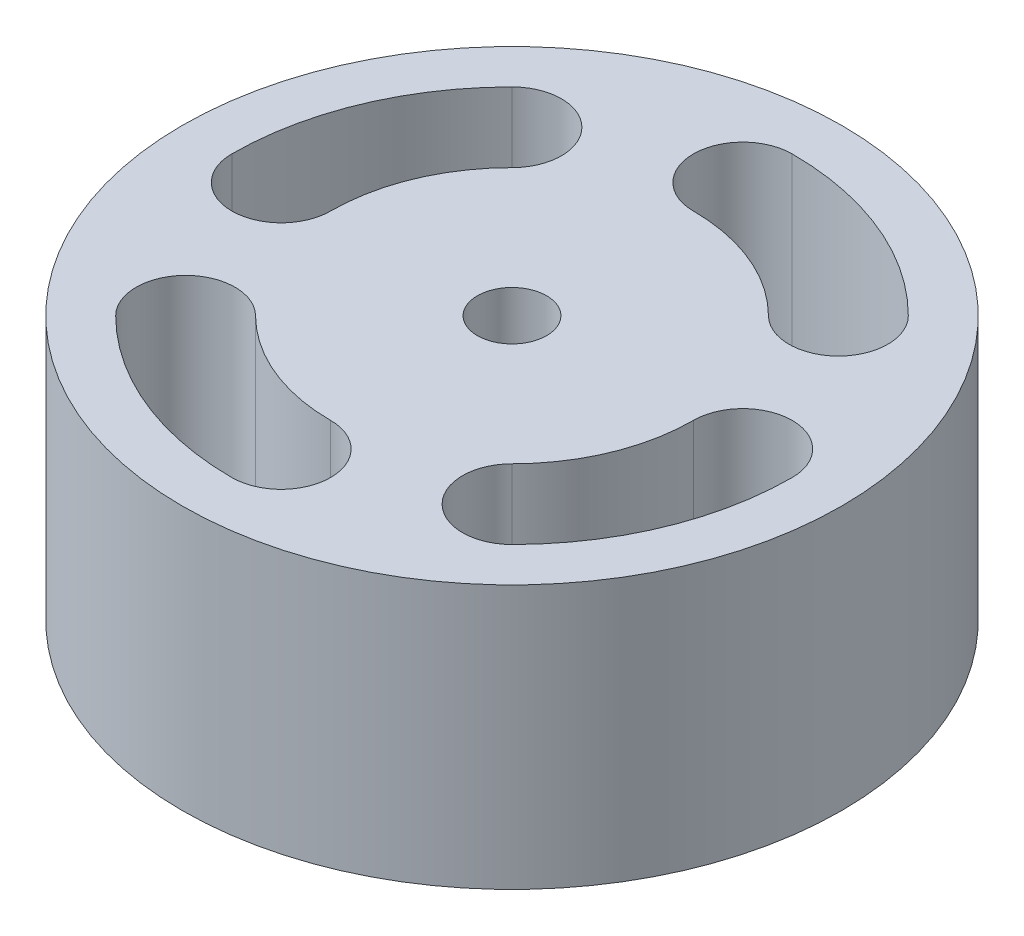
ISO-10303-21;
HEADER;
FILE_DESCRIPTION(('STEP AP214'),'2;1');
FILE_NAME('part.step','',(''),(''),'','','');
FILE_SCHEMA(('AUTOMOTIVE_DESIGN { 1 0 10303 214 1 1 1 1 }'));
ENDSEC;
DATA;
#1=APPLICATION_CONTEXT('core data for automotive mechanical design processes');
#2=APPLICATION_PROTOCOL_DEFINITION('international standard','automotive_design',2000,#1);
#3=PRODUCT_CONTEXT('',#1,'mechanical');
#4=PRODUCT('Part','Part','',(#3));
#5=PRODUCT_RELATED_PRODUCT_CATEGORY('part','',(#4));
#6=PRODUCT_DEFINITION_FORMATION('','',#4);
#7=PRODUCT_DEFINITION_CONTEXT('part definition',#1,'design');
#8=PRODUCT_DEFINITION('design','',#6,#7);
#9=PRODUCT_DEFINITION_SHAPE('','',#8);
#10=(LENGTH_UNIT() NAMED_UNIT(*) SI_UNIT(.MILLI.,.METRE.));
#11=(NAMED_UNIT(*) PLANE_ANGLE_UNIT() SI_UNIT($,.RADIAN.));
#12=(NAMED_UNIT(*) SI_UNIT($,.STERADIAN.) SOLID_ANGLE_UNIT());
#13=UNCERTAINTY_MEASURE_WITH_UNIT(LENGTH_MEASURE(1.E-05),#10,'distance_accuracy_value','');
#14=(GEOMETRIC_REPRESENTATION_CONTEXT(3) GLOBAL_UNCERTAINTY_ASSIGNED_CONTEXT((#13)) GLOBAL_UNIT_ASSIGNED_CONTEXT((#10,
#11,#12)) REPRESENTATION_CONTEXT('',''));
#15=CARTESIAN_POINT('',(0.,0.,0.));
#16=DIRECTION('',(0.,0.,1.));
#17=DIRECTION('',(1.,0.,0.));
#18=AXIS2_PLACEMENT_3D('',#15,#16,#17);
#19=CARTESIAN_POINT('',(0.,20.,0.));
#20=DIRECTION('',(0.,-1.,0.));
#21=DIRECTION('',(0.,0.,-1.));
#22=AXIS2_PLACEMENT_3D('',#19,#20,#21);
#23=CYLINDRICAL_SURFACE('',#22,50.);
#24=CARTESIAN_POINT('',(0.,20.,0.));
#25=DIRECTION('',(0.,1.,0.));
#26=DIRECTION('',(0.,0.,1.));
#27=AXIS2_PLACEMENT_3D('',#24,#25,#26);
#28=CIRCLE('',#27,50.);
#29=CARTESIAN_POINT('',(0.,20.,50.));
#30=VERTEX_POINT('',#29);
#31=EDGE_CURVE('E11',#30,#30,#28,.T.);
#32=ORIENTED_EDGE('',*,*,#31,.F.);
#33=EDGE_LOOP('',(#32));
#34=FACE_BOUND('',#33,.T.);
#35=CARTESIAN_POINT('',(0.,-20.,0.));
#36=DIRECTION('',(0.,-1.,0.));
#37=DIRECTION('',(0.,0.,-1.));
#38=AXIS2_PLACEMENT_3D('',#35,#36,#37);
#39=CIRCLE('',#38,50.);
#40=CARTESIAN_POINT('',(0.,-20.,-50.));
#41=VERTEX_POINT('',#40);
#42=EDGE_CURVE('E225',#41,#41,#39,.T.);
#43=ORIENTED_EDGE('',*,*,#42,.F.);
#44=EDGE_LOOP('',(#43));
#45=FACE_BOUND('',#44,.T.);
#46=ADVANCED_FACE('F47',(#34,#45),#23,.T.);
#47=CARTESIAN_POINT('',(0.,20.,0.));
#48=DIRECTION('',(0.,1.,0.));
#49=DIRECTION('',(0.,0.,1.));
#50=AXIS2_PLACEMENT_3D('',#47,#48,#49);
#51=PLANE('',#50);
#52=CARTESIAN_POINT('',(0.,20.,-35.));
#53=DIRECTION('',(0.,1.,0.));
#54=DIRECTION('',(0.,0.,1.));
#55=AXIS2_PLACEMENT_3D('',#52,#53,#54);
#56=CIRCLE('',#55,7.5);
#57=CARTESIAN_POINT('',(0.,20.,-42.5));
#58=VERTEX_POINT('',#57);
#59=CARTESIAN_POINT('',(0.,20.,-27.5));
#60=VERTEX_POINT('',#59);
#61=EDGE_CURVE('E61',#58,#60,#56,.T.);
#62=ORIENTED_EDGE('',*,*,#61,.F.);
#63=CARTESIAN_POINT('',(0.,20.,0.));
#64=DIRECTION('',(0.,1.,0.));
#65=DIRECTION('',(0.,0.,1.));
#66=AXIS2_PLACEMENT_3D('',#63,#64,#65);
#67=CIRCLE('',#66,42.5);
#68=CARTESIAN_POINT('',(30.0520382004283,20.,-30.0520382004282));
#69=VERTEX_POINT('',#68);
#70=EDGE_CURVE('E268',#69,#58,#67,.T.);
#71=ORIENTED_EDGE('',*,*,#70,.F.);
#72=CARTESIAN_POINT('',(24.7487373415292,20.,-24.7487373415291));
#73=DIRECTION('',(0.,1.,0.));
#74=DIRECTION('',(0.,0.,1.));
#75=AXIS2_PLACEMENT_3D('',#72,#73,#74);
#76=CIRCLE('',#75,7.5);
#77=CARTESIAN_POINT('',(19.4454364826301,20.,-19.44543648263));
#78=VERTEX_POINT('',#77);
#79=EDGE_CURVE('E265',#78,#69,#76,.T.);
#80=ORIENTED_EDGE('',*,*,#79,.F.);
#81=CARTESIAN_POINT('',(0.,20.,0.));
#82=DIRECTION('',(0.,1.,0.));
#83=DIRECTION('',(0.,0.,1.));
#84=AXIS2_PLACEMENT_3D('',#81,#82,#83);
#85=CIRCLE('',#84,27.5);
#86=EDGE_CURVE('E262',#78,#60,#85,.T.);
#87=ORIENTED_EDGE('',*,*,#86,.T.);
#88=EDGE_LOOP('',(#62,#71,#80,#87));
#89=FACE_BOUND('',#88,.T.);
#90=CARTESIAN_POINT('',(35.,20.,1.2220184685951E-13));
#91=DIRECTION('',(0.,1.,0.));
#92=DIRECTION('',(0.,0.,1.));
#93=AXIS2_PLACEMENT_3D('',#90,#91,#92);
#94=CIRCLE('',#93,7.5);
#95=CARTESIAN_POINT('',(42.5,20.,1.48387956900833E-13));
#96=VERTEX_POINT('',#95);
#97=CARTESIAN_POINT('',(27.5,20.,0.));
#98=VERTEX_POINT('',#97);
#99=EDGE_CURVE('E69',#96,#98,#94,.T.);
#100=ORIENTED_EDGE('',*,*,#99,.F.);
#101=CARTESIAN_POINT('',(0.,20.,0.));
#102=DIRECTION('',(0.,1.,0.));
#103=DIRECTION('',(0.,0.,1.));
#104=AXIS2_PLACEMENT_3D('',#101,#102,#103);
#105=CIRCLE('',#104,42.5);
#106=CARTESIAN_POINT('',(30.0520382004281,20.,30.0520382004284));
#107=VERTEX_POINT('',#106);
#108=EDGE_CURVE('E251',#107,#96,#105,.T.);
#109=ORIENTED_EDGE('',*,*,#108,.F.);
#110=CARTESIAN_POINT('',(24.748737341529,20.,24.7487373415293));
#111=DIRECTION('',(0.,1.,0.));
#112=DIRECTION('',(0.,0.,1.));
#113=AXIS2_PLACEMENT_3D('',#110,#111,#112);
#114=CIRCLE('',#113,7.5);
#115=CARTESIAN_POINT('',(19.44543648263,20.,19.4454364826302));
#116=VERTEX_POINT('',#115);
#117=EDGE_CURVE('E248',#116,#107,#114,.T.);
#118=ORIENTED_EDGE('',*,*,#117,.F.);
#119=CARTESIAN_POINT('',(0.,20.,0.));
#120=DIRECTION('',(0.,1.,0.));
#121=DIRECTION('',(0.,0.,1.));
#122=AXIS2_PLACEMENT_3D('',#119,#120,#121);
#123=CIRCLE('',#122,27.5);
#124=EDGE_CURVE('E244',#116,#98,#123,.T.);
#125=ORIENTED_EDGE('',*,*,#124,.T.);
#126=EDGE_LOOP('',(#100,#109,#118,#125));
#127=FACE_BOUND('',#126,.T.);
#128=CARTESIAN_POINT('',(0.,20.,0.));
#129=DIRECTION('',(0.,1.,0.));
#130=DIRECTION('',(0.,0.,1.));
#131=AXIS2_PLACEMENT_3D('',#128,#129,#130);
#132=CIRCLE('',#131,42.5);
#133=CARTESIAN_POINT('',(-30.0520382004285,20.,30.052038200428));
#134=VERTEX_POINT('',#133);
#135=CARTESIAN_POINT('',(-2.44403693719019E-13,20.,42.5));
#136=VERTEX_POINT('',#135);
#137=EDGE_CURVE('E165',#134,#136,#132,.T.);
#138=ORIENTED_EDGE('',*,*,#137,.F.);
#139=CARTESIAN_POINT('',(-24.7487373415294,20.,24.748737341529));
#140=DIRECTION('',(0.,1.,0.));
#141=DIRECTION('',(0.,0.,1.));
#142=AXIS2_PLACEMENT_3D('',#139,#140,#141);
#143=CIRCLE('',#142,7.5);
#144=CARTESIAN_POINT('',(-19.4454364826302,20.,19.4454364826299));
#145=VERTEX_POINT('',#144);
#146=EDGE_CURVE('E170',#145,#134,#143,.T.);
#147=ORIENTED_EDGE('',*,*,#146,.F.);
#148=CARTESIAN_POINT('',(0.,20.,0.));
#149=DIRECTION('',(0.,1.,0.));
#150=DIRECTION('',(0.,0.,1.));
#151=AXIS2_PLACEMENT_3D('',#148,#149,#150);
#152=CIRCLE('',#151,27.5);
#153=CARTESIAN_POINT('',(-1.92031473636372E-13,20.,27.5));
#154=VERTEX_POINT('',#153);
#155=EDGE_CURVE('E232',#145,#154,#152,.T.);
#156=ORIENTED_EDGE('',*,*,#155,.T.);
#157=CARTESIAN_POINT('',(-2.44403693719019E-13,20.,35.));
#158=DIRECTION('',(0.,1.,0.));
#159=DIRECTION('',(0.,0.,1.));
#160=AXIS2_PLACEMENT_3D('',#157,#158,#159);
#161=CIRCLE('',#160,7.5);
#162=EDGE_CURVE('E229',#136,#154,#161,.T.);
#163=ORIENTED_EDGE('',*,*,#162,.F.);
#164=EDGE_LOOP('',(#138,#147,#156,#163));
#165=FACE_BOUND('',#164,.T.);
#166=CARTESIAN_POINT('',(0.,20.,0.));
#167=DIRECTION('',(0.,1.,0.));
#168=DIRECTION('',(0.,0.,1.));
#169=AXIS2_PLACEMENT_3D('',#166,#167,#168);
#170=CIRCLE('',#169,42.5);
#171=CARTESIAN_POINT('',(-30.0520382004279,20.,-30.0520382004286));
#172=VERTEX_POINT('',#171);
#173=CARTESIAN_POINT('',(-42.5,20.,-4.451638707025E-13));
#174=VERTEX_POINT('',#173);
#175=EDGE_CURVE('E239',#172,#174,#170,.T.);
#176=ORIENTED_EDGE('',*,*,#175,.F.);
#177=CARTESIAN_POINT('',(-24.7487373415289,20.,-24.7487373415295));
#178=DIRECTION('',(0.,1.,0.));
#179=DIRECTION('',(0.,0.,1.));
#180=AXIS2_PLACEMENT_3D('',#177,#178,#179);
#181=CIRCLE('',#180,7.5);
#182=CARTESIAN_POINT('',(-19.4454364826298,20.,-19.4454364826303));
#183=VERTEX_POINT('',#182);
#184=EDGE_CURVE('E285',#183,#172,#181,.T.);
#185=ORIENTED_EDGE('',*,*,#184,.F.);
#186=CARTESIAN_POINT('',(0.,20.,0.));
#187=DIRECTION('',(0.,1.,0.));
#188=DIRECTION('',(0.,0.,1.));
#189=AXIS2_PLACEMENT_3D('',#186,#187,#188);
#190=CIRCLE('',#189,27.5);
#191=CARTESIAN_POINT('',(-27.5,20.,-2.88047210454559E-13));
#192=VERTEX_POINT('',#191);
#193=EDGE_CURVE('E282',#183,#192,#190,.T.);
#194=ORIENTED_EDGE('',*,*,#193,.T.);
#195=CARTESIAN_POINT('',(-35.,20.,-3.66605540578529E-13));
#196=DIRECTION('',(0.,1.,0.));
#197=DIRECTION('',(0.,0.,1.));
#198=AXIS2_PLACEMENT_3D('',#195,#196,#197);
#199=CIRCLE('',#198,7.5);
#200=EDGE_CURVE('E279',#174,#192,#199,.T.);
#201=ORIENTED_EDGE('',*,*,#200,.F.);
#202=EDGE_LOOP('',(#176,#185,#194,#201));
#203=FACE_BOUND('',#202,.T.);
#204=CARTESIAN_POINT('',(0.,20.,0.));
#205=DIRECTION('',(0.,1.,0.));
#206=DIRECTION('',(0.,0.,1.));
#207=AXIS2_PLACEMENT_3D('',#204,#205,#206);
#208=CIRCLE('',#207,5.25);
#209=CARTESIAN_POINT('',(0.,20.,5.25));
#210=VERTEX_POINT('',#209);
#211=EDGE_CURVE('E54',#210,#210,#208,.T.);
#212=ORIENTED_EDGE('',*,*,#211,.F.);
#213=EDGE_LOOP('',(#212));
#214=FACE_BOUND('',#213,.T.);
#215=ORIENTED_EDGE('',*,*,#31,.T.);
#216=EDGE_LOOP('',(#215));
#217=FACE_BOUND('',#216,.T.);
#218=ADVANCED_FACE('F302',(#89,#127,#165,#203,#214,#217),#51,.T.);
#219=CARTESIAN_POINT('',(0.,0.,0.));
#220=DIRECTION('',(0.,1.,0.));
#221=DIRECTION('',(0.,0.,1.));
#222=AXIS2_PLACEMENT_3D('',#219,#220,#221);
#223=CYLINDRICAL_SURFACE('',#222,5.25);
#224=ORIENTED_EDGE('',*,*,#211,.T.);
#225=EDGE_LOOP('',(#224));
#226=FACE_BOUND('',#225,.T.);
#227=CARTESIAN_POINT('',(0.,-20.,0.));
#228=DIRECTION('',(0.,-1.,0.));
#229=DIRECTION('',(0.,0.,-1.));
#230=AXIS2_PLACEMENT_3D('',#227,#228,#229);
#231=CIRCLE('',#230,5.25);
#232=CARTESIAN_POINT('',(0.,-20.,-5.25));
#233=VERTEX_POINT('',#232);
#234=EDGE_CURVE('E222',#233,#233,#231,.F.);
#235=ORIENTED_EDGE('',*,*,#234,.F.);
#236=EDGE_LOOP('',(#235));
#237=FACE_BOUND('',#236,.T.);
#238=ADVANCED_FACE('F299',(#226,#237),#223,.F.);
#239=CARTESIAN_POINT('',(0.,0.,0.));
#240=DIRECTION('',(0.,1.,0.));
#241=DIRECTION('',(0.,0.,1.));
#242=AXIS2_PLACEMENT_3D('',#239,#240,#241);
#243=CYLINDRICAL_SURFACE('',#242,42.5);
#244=ORIENTED_EDGE('',*,*,#175,.T.);
#245=DIRECTION('',(0.,1.,0.));
#246=VECTOR('',#245,1.);
#247=CARTESIAN_POINT('',(-42.5,0.,-4.451638707025E-13));
#248=LINE('',#247,#246);
#249=CARTESIAN_POINT('',(-42.5,-20.,-4.47919326000581E-13));
#250=VERTEX_POINT('',#249);
#251=EDGE_CURVE('E288',#250,#174,#248,.T.);
#252=ORIENTED_EDGE('',*,*,#251,.F.);
#253=CARTESIAN_POINT('',(0.,-20.,0.));
#254=DIRECTION('',(0.,-1.,0.));
#255=DIRECTION('',(0.,0.,-1.));
#256=AXIS2_PLACEMENT_3D('',#253,#254,#255);
#257=CIRCLE('',#256,42.5);
#258=CARTESIAN_POINT('',(-30.0520382004279,-20.,-30.0520382004287));
#259=VERTEX_POINT('',#258);
#260=EDGE_CURVE('E187',#250,#259,#257,.T.);
#261=ORIENTED_EDGE('',*,*,#260,.T.);
#262=DIRECTION('',(0.,1.,0.));
#263=VECTOR('',#262,1.);
#264=CARTESIAN_POINT('',(-30.0520382004279,0.,-30.0520382004286));
#265=LINE('',#264,#263);
#266=EDGE_CURVE('E289',#259,#172,#265,.T.);
#267=ORIENTED_EDGE('',*,*,#266,.T.);
#268=EDGE_LOOP('',(#244,#252,#261,#267));
#269=FACE_BOUND('',#268,.T.);
#270=ADVANCED_FACE('F363',(#269),#243,.F.);
#271=CARTESIAN_POINT('',(-24.7487373415289,0.,-24.7487373415295));
#272=DIRECTION('',(0.,1.,0.));
#273=DIRECTION('',(0.,0.,1.));
#274=AXIS2_PLACEMENT_3D('',#271,#272,#273);
#275=CYLINDRICAL_SURFACE('',#274,7.5);
#276=ORIENTED_EDGE('',*,*,#184,.T.);
#277=ORIENTED_EDGE('',*,*,#266,.F.);
#278=CARTESIAN_POINT('',(-24.7487373415289,-20.,-24.7487373415295));
#279=DIRECTION('',(0.,-1.,0.));
#280=DIRECTION('',(0.,0.,-1.));
#281=AXIS2_PLACEMENT_3D('',#278,#279,#280);
#282=CIRCLE('',#281,7.5);
#283=CARTESIAN_POINT('',(-19.4454364826298,-20.,-19.4454364826303));
#284=VERTEX_POINT('',#283);
#285=EDGE_CURVE('E202',#284,#259,#282,.F.);
#286=ORIENTED_EDGE('',*,*,#285,.F.);
#287=DIRECTION('',(0.,1.,0.));
#288=VECTOR('',#287,1.);
#289=CARTESIAN_POINT('',(-19.4454364826298,0.,-19.4454364826303));
#290=LINE('',#289,#288);
#291=EDGE_CURVE('E291',#284,#183,#290,.T.);
#292=ORIENTED_EDGE('',*,*,#291,.T.);
#293=EDGE_LOOP('',(#276,#277,#286,#292));
#294=FACE_BOUND('',#293,.T.);
#295=ADVANCED_FACE('F359',(#294),#275,.F.);
#296=CARTESIAN_POINT('',(0.,0.,0.));
#297=DIRECTION('',(0.,1.,0.));
#298=DIRECTION('',(0.,0.,1.));
#299=AXIS2_PLACEMENT_3D('',#296,#297,#298);
#300=CYLINDRICAL_SURFACE('',#299,27.5);
#301=ORIENTED_EDGE('',*,*,#193,.F.);
#302=ORIENTED_EDGE('',*,*,#291,.F.);
#303=CARTESIAN_POINT('',(0.,-20.,0.));
#304=DIRECTION('',(0.,-1.,0.));
#305=DIRECTION('',(0.,0.,-1.));
#306=AXIS2_PLACEMENT_3D('',#303,#304,#305);
#307=CIRCLE('',#306,27.5);
#308=CARTESIAN_POINT('',(-27.5,-20.,-2.85308762516775E-13));
#309=VERTEX_POINT('',#308);
#310=EDGE_CURVE('E197',#309,#284,#307,.T.);
#311=ORIENTED_EDGE('',*,*,#310,.F.);
#312=DIRECTION('',(0.,1.,0.));
#313=VECTOR('',#312,1.);
#314=CARTESIAN_POINT('',(-27.5,0.,-2.88047210454559E-13));
#315=LINE('',#314,#313);
#316=EDGE_CURVE('E293',#309,#192,#315,.T.);
#317=ORIENTED_EDGE('',*,*,#316,.T.);
#318=EDGE_LOOP('',(#301,#302,#311,#317));
#319=FACE_BOUND('',#318,.T.);
#320=ADVANCED_FACE('F362',(#319),#300,.T.);
#321=CARTESIAN_POINT('',(-35.,0.,-3.66605540578529E-13));
#322=DIRECTION('',(0.,1.,0.));
#323=DIRECTION('',(0.,0.,1.));
#324=AXIS2_PLACEMENT_3D('',#321,#322,#323);
#325=CYLINDRICAL_SURFACE('',#324,7.5);
#326=ORIENTED_EDGE('',*,*,#200,.T.);
#327=ORIENTED_EDGE('',*,*,#316,.F.);
#328=CARTESIAN_POINT('',(-35.,-20.,-3.66605540578529E-13));
#329=DIRECTION('',(0.,-1.,0.));
#330=DIRECTION('',(0.,0.,-1.));
#331=AXIS2_PLACEMENT_3D('',#328,#329,#330);
#332=CIRCLE('',#331,7.5);
#333=EDGE_CURVE('E193',#250,#309,#332,.F.);
#334=ORIENTED_EDGE('',*,*,#333,.F.);
#335=ORIENTED_EDGE('',*,*,#251,.T.);
#336=EDGE_LOOP('',(#326,#327,#334,#335));
#337=FACE_BOUND('',#336,.T.);
#338=ADVANCED_FACE('F335',(#337),#325,.F.);
#339=CARTESIAN_POINT('',(0.,0.,0.));
#340=DIRECTION('',(0.,1.,0.));
#341=DIRECTION('',(0.,0.,1.));
#342=AXIS2_PLACEMENT_3D('',#339,#340,#341);
#343=CYLINDRICAL_SURFACE('',#342,42.5);
#344=ORIENTED_EDGE('',*,*,#137,.T.);
#345=DIRECTION('',(0.,1.,0.));
#346=VECTOR('',#345,1.);
#347=CARTESIAN_POINT('',(-2.96775913801666E-13,0.,42.5));
#348=LINE('',#347,#346);
#349=CARTESIAN_POINT('',(-2.97694398901027E-13,-20.,42.5));
#350=VERTEX_POINT('',#349);
#351=EDGE_CURVE('E159',#350,#136,#348,.T.);
#352=ORIENTED_EDGE('',*,*,#351,.F.);
#353=CARTESIAN_POINT('',(-30.0520382004286,-20.,30.052038200428));
#354=VERTEX_POINT('',#353);
#355=EDGE_CURVE('E163',#350,#354,#257,.T.);
#356=ORIENTED_EDGE('',*,*,#355,.T.);
#357=DIRECTION('',(0.,1.,0.));
#358=VECTOR('',#357,1.);
#359=CARTESIAN_POINT('',(-30.0520382004285,0.,30.052038200428));
#360=LINE('',#359,#358);
#361=EDGE_CURVE('E237',#354,#134,#360,.T.);
#362=ORIENTED_EDGE('',*,*,#361,.T.);
#363=EDGE_LOOP('',(#344,#352,#356,#362));
#364=FACE_BOUND('',#363,.T.);
#365=ADVANCED_FACE('F161',(#364),#343,.F.);
#366=CARTESIAN_POINT('',(-24.7487373415294,0.,24.748737341529));
#367=DIRECTION('',(0.,1.,0.));
#368=DIRECTION('',(0.,0.,1.));
#369=AXIS2_PLACEMENT_3D('',#366,#367,#368);
#370=CYLINDRICAL_SURFACE('',#369,7.5);
#371=ORIENTED_EDGE('',*,*,#146,.T.);
#372=ORIENTED_EDGE('',*,*,#361,.F.);
#373=CARTESIAN_POINT('',(-24.7487373415294,-20.,24.748737341529));
#374=DIRECTION('',(0.,-1.,0.));
#375=DIRECTION('',(0.,0.,-1.));
#376=AXIS2_PLACEMENT_3D('',#373,#374,#375);
#377=CIRCLE('',#376,7.5);
#378=CARTESIAN_POINT('',(-19.4454364826302,-20.,19.4454364826299));
#379=VERTEX_POINT('',#378);
#380=EDGE_CURVE('E184',#379,#354,#377,.F.);
#381=ORIENTED_EDGE('',*,*,#380,.F.);
#382=DIRECTION('',(0.,1.,0.));
#383=VECTOR('',#382,1.);
#384=CARTESIAN_POINT('',(-19.4454364826302,0.,19.4454364826299));
#385=LINE('',#384,#383);
#386=EDGE_CURVE('E240',#379,#145,#385,.T.);
#387=ORIENTED_EDGE('',*,*,#386,.T.);
#388=EDGE_LOOP('',(#371,#372,#381,#387));
#389=FACE_BOUND('',#388,.T.);
#390=ADVANCED_FACE('F322',(#389),#370,.F.);
#391=CARTESIAN_POINT('',(0.,0.,0.));
#392=DIRECTION('',(0.,1.,0.));
#393=DIRECTION('',(0.,0.,1.));
#394=AXIS2_PLACEMENT_3D('',#391,#392,#393);
#395=CYLINDRICAL_SURFACE('',#394,27.5);
#396=ORIENTED_EDGE('',*,*,#155,.F.);
#397=ORIENTED_EDGE('',*,*,#386,.F.);
#398=CARTESIAN_POINT('',(-1.92031473636372E-13,-20.,27.5));
#399=VERTEX_POINT('',#398);
#400=EDGE_CURVE('E178',#399,#379,#307,.T.);
#401=ORIENTED_EDGE('',*,*,#400,.F.);
#402=DIRECTION('',(0.,1.,0.));
#403=VECTOR('',#402,1.);
#404=CARTESIAN_POINT('',(-1.92031473636372E-13,0.,27.5));
#405=LINE('',#404,#403);
#406=EDGE_CURVE('E169',#399,#154,#405,.T.);
#407=ORIENTED_EDGE('',*,*,#406,.T.);
#408=EDGE_LOOP('',(#396,#397,#401,#407));
#409=FACE_BOUND('',#408,.T.);
#410=ADVANCED_FACE('F325',(#409),#395,.T.);
#411=CARTESIAN_POINT('',(-2.44403693719019E-13,0.,35.));
#412=DIRECTION('',(0.,1.,0.));
#413=DIRECTION('',(0.,0.,1.));
#414=AXIS2_PLACEMENT_3D('',#411,#412,#413);
#415=CYLINDRICAL_SURFACE('',#414,7.5);
#416=ORIENTED_EDGE('',*,*,#162,.T.);
#417=ORIENTED_EDGE('',*,*,#406,.F.);
#418=CARTESIAN_POINT('',(-2.44403693719019E-13,-20.,35.));
#419=DIRECTION('',(0.,-1.,0.));
#420=DIRECTION('',(0.,0.,-1.));
#421=AXIS2_PLACEMENT_3D('',#418,#419,#420);
#422=CIRCLE('',#421,7.5);
#423=EDGE_CURVE('E173',#350,#399,#422,.F.);
#424=ORIENTED_EDGE('',*,*,#423,.F.);
#425=ORIENTED_EDGE('',*,*,#351,.T.);
#426=EDGE_LOOP('',(#416,#417,#424,#425));
#427=FACE_BOUND('',#426,.T.);
#428=ADVANCED_FACE('F174',(#427),#415,.F.);
#429=CARTESIAN_POINT('',(35.,0.,1.2220184685951E-13));
#430=DIRECTION('',(0.,1.,0.));
#431=DIRECTION('',(0.,0.,1.));
#432=AXIS2_PLACEMENT_3D('',#429,#430,#431);
#433=CYLINDRICAL_SURFACE('',#432,7.5);
#434=ORIENTED_EDGE('',*,*,#99,.T.);
#435=DIRECTION('',(0.,1.,0.));
#436=VECTOR('',#435,1.);
#437=CARTESIAN_POINT('',(27.5,0.,0.));
#438=LINE('',#437,#436);
#439=CARTESIAN_POINT('',(27.5,-20.,0.));
#440=VERTEX_POINT('',#439);
#441=EDGE_CURVE('E254',#440,#98,#438,.T.);
#442=ORIENTED_EDGE('',*,*,#441,.F.);
#443=CARTESIAN_POINT('',(35.,-20.,1.2220184685951E-13));
#444=DIRECTION('',(0.,-1.,0.));
#445=DIRECTION('',(0.,0.,-1.));
#446=AXIS2_PLACEMENT_3D('',#443,#444,#445);
#447=CIRCLE('',#446,7.5);
#448=CARTESIAN_POINT('',(42.5,-20.,1.47641107463256E-13));
#449=VERTEX_POINT('',#448);
#450=EDGE_CURVE('E189',#449,#440,#447,.F.);
#451=ORIENTED_EDGE('',*,*,#450,.F.);
#452=DIRECTION('',(0.,1.,0.));
#453=VECTOR('',#452,1.);
#454=CARTESIAN_POINT('',(42.5,0.,1.48387956900833E-13));
#455=LINE('',#454,#453);
#456=EDGE_CURVE('E230',#449,#96,#455,.T.);
#457=ORIENTED_EDGE('',*,*,#456,.T.);
#458=EDGE_LOOP('',(#434,#442,#451,#457));
#459=FACE_BOUND('',#458,.T.);
#460=ADVANCED_FACE('F332',(#459),#433,.F.);
#461=CARTESIAN_POINT('',(0.,0.,0.));
#462=DIRECTION('',(0.,1.,0.));
#463=DIRECTION('',(0.,0.,1.));
#464=AXIS2_PLACEMENT_3D('',#461,#462,#463);
#465=CYLINDRICAL_SURFACE('',#464,42.5);
#466=ORIENTED_EDGE('',*,*,#108,.T.);
#467=ORIENTED_EDGE('',*,*,#456,.F.);
#468=CARTESIAN_POINT('',(30.0520382004281,-20.,30.0520382004284));
#469=VERTEX_POINT('',#468);
#470=EDGE_CURVE('E186',#449,#469,#257,.T.);
#471=ORIENTED_EDGE('',*,*,#470,.T.);
#472=DIRECTION('',(0.,1.,0.));
#473=VECTOR('',#472,1.);
#474=CARTESIAN_POINT('',(30.0520382004281,0.,30.0520382004284));
#475=LINE('',#474,#473);
#476=EDGE_CURVE('E256',#469,#107,#475,.T.);
#477=ORIENTED_EDGE('',*,*,#476,.T.);
#478=EDGE_LOOP('',(#466,#467,#471,#477));
#479=FACE_BOUND('',#478,.T.);
#480=ADVANCED_FACE('F336',(#479),#465,.F.);
#481=CARTESIAN_POINT('',(24.748737341529,0.,24.7487373415293));
#482=DIRECTION('',(0.,1.,0.));
#483=DIRECTION('',(0.,0.,1.));
#484=AXIS2_PLACEMENT_3D('',#481,#482,#483);
#485=CYLINDRICAL_SURFACE('',#484,7.5);
#486=ORIENTED_EDGE('',*,*,#117,.T.);
#487=ORIENTED_EDGE('',*,*,#476,.F.);
#488=CARTESIAN_POINT('',(24.748737341529,-20.,24.7487373415293));
#489=DIRECTION('',(0.,-1.,0.));
#490=DIRECTION('',(0.,0.,-1.));
#491=AXIS2_PLACEMENT_3D('',#488,#489,#490);
#492=CIRCLE('',#491,7.5);
#493=CARTESIAN_POINT('',(19.44543648263,-20.,19.4454364826302));
#494=VERTEX_POINT('',#493);
#495=EDGE_CURVE('E190',#494,#469,#492,.F.);
#496=ORIENTED_EDGE('',*,*,#495,.F.);
#497=DIRECTION('',(0.,1.,0.));
#498=VECTOR('',#497,1.);
#499=CARTESIAN_POINT('',(19.44543648263,0.,19.4454364826302));
#500=LINE('',#499,#498);
#501=EDGE_CURVE('E258',#494,#116,#500,.T.);
#502=ORIENTED_EDGE('',*,*,#501,.T.);
#503=EDGE_LOOP('',(#486,#487,#496,#502));
#504=FACE_BOUND('',#503,.T.);
#505=ADVANCED_FACE('F339',(#504),#485,.F.);
#506=CARTESIAN_POINT('',(0.,0.,0.));
#507=DIRECTION('',(0.,1.,0.));
#508=DIRECTION('',(0.,0.,1.));
#509=AXIS2_PLACEMENT_3D('',#506,#507,#508);
#510=CYLINDRICAL_SURFACE('',#509,27.5);
#511=ORIENTED_EDGE('',*,*,#124,.F.);
#512=ORIENTED_EDGE('',*,*,#501,.F.);
#513=EDGE_CURVE('E221',#440,#494,#307,.T.);
#514=ORIENTED_EDGE('',*,*,#513,.F.);
#515=ORIENTED_EDGE('',*,*,#441,.T.);
#516=EDGE_LOOP('',(#511,#512,#514,#515));
#517=FACE_BOUND('',#516,.T.);
#518=ADVANCED_FACE('F343',(#517),#510,.T.);
#519=CARTESIAN_POINT('',(0.,0.,-35.));
#520=DIRECTION('',(0.,1.,0.));
#521=DIRECTION('',(0.,0.,1.));
#522=AXIS2_PLACEMENT_3D('',#519,#520,#521);
#523=CYLINDRICAL_SURFACE('',#522,7.5);
#524=ORIENTED_EDGE('',*,*,#61,.T.);
#525=DIRECTION('',(0.,1.,0.));
#526=VECTOR('',#525,1.);
#527=CARTESIAN_POINT('',(0.,0.,-27.5));
#528=LINE('',#527,#526);
#529=CARTESIAN_POINT('',(0.,-20.,-27.5));
#530=VERTEX_POINT('',#529);
#531=EDGE_CURVE('E271',#530,#60,#528,.T.);
#532=ORIENTED_EDGE('',*,*,#531,.F.);
#533=CARTESIAN_POINT('',(0.,-20.,-35.));
#534=DIRECTION('',(0.,-1.,0.));
#535=DIRECTION('',(0.,0.,-1.));
#536=AXIS2_PLACEMENT_3D('',#533,#534,#535);
#537=CIRCLE('',#536,7.5);
#538=CARTESIAN_POINT('',(0.,-20.,-42.5));
#539=VERTEX_POINT('',#538);
#540=EDGE_CURVE('E201',#539,#530,#537,.F.);
#541=ORIENTED_EDGE('',*,*,#540,.F.);
#542=DIRECTION('',(0.,1.,0.));
#543=VECTOR('',#542,1.);
#544=CARTESIAN_POINT('',(0.,0.,-42.5));
#545=LINE('',#544,#543);
#546=EDGE_CURVE('E245',#539,#58,#545,.T.);
#547=ORIENTED_EDGE('',*,*,#546,.T.);
#548=EDGE_LOOP('',(#524,#532,#541,#547));
#549=FACE_BOUND('',#548,.T.);
#550=ADVANCED_FACE('F347',(#549),#523,.F.);
#551=CARTESIAN_POINT('',(0.,0.,0.));
#552=DIRECTION('',(0.,1.,0.));
#553=DIRECTION('',(0.,0.,1.));
#554=AXIS2_PLACEMENT_3D('',#551,#552,#553);
#555=CYLINDRICAL_SURFACE('',#554,42.5);
#556=ORIENTED_EDGE('',*,*,#70,.T.);
#557=ORIENTED_EDGE('',*,*,#546,.F.);
#558=CARTESIAN_POINT('',(30.0520382004283,-20.,-30.0520382004282));
#559=VERTEX_POINT('',#558);
#560=EDGE_CURVE('E191',#539,#559,#257,.T.);
#561=ORIENTED_EDGE('',*,*,#560,.T.);
#562=DIRECTION('',(0.,1.,0.));
#563=VECTOR('',#562,1.);
#564=CARTESIAN_POINT('',(30.0520382004283,0.,-30.0520382004282));
#565=LINE('',#564,#563);
#566=EDGE_CURVE('E273',#559,#69,#565,.T.);
#567=ORIENTED_EDGE('',*,*,#566,.T.);
#568=EDGE_LOOP('',(#556,#557,#561,#567));
#569=FACE_BOUND('',#568,.T.);
#570=ADVANCED_FACE('F351',(#569),#555,.F.);
#571=CARTESIAN_POINT('',(24.7487373415292,0.,-24.7487373415291));
#572=DIRECTION('',(0.,1.,0.));
#573=DIRECTION('',(0.,0.,1.));
#574=AXIS2_PLACEMENT_3D('',#571,#572,#573);
#575=CYLINDRICAL_SURFACE('',#574,7.5);
#576=ORIENTED_EDGE('',*,*,#79,.T.);
#577=ORIENTED_EDGE('',*,*,#566,.F.);
#578=CARTESIAN_POINT('',(24.7487373415292,-20.,-24.7487373415291));
#579=DIRECTION('',(0.,-1.,0.));
#580=DIRECTION('',(0.,0.,-1.));
#581=AXIS2_PLACEMENT_3D('',#578,#579,#580);
#582=CIRCLE('',#581,7.5);
#583=CARTESIAN_POINT('',(19.4454364826301,-20.,-19.44543648263));
#584=VERTEX_POINT('',#583);
#585=EDGE_CURVE('E214',#584,#559,#582,.F.);
#586=ORIENTED_EDGE('',*,*,#585,.F.);
#587=DIRECTION('',(0.,1.,0.));
#588=VECTOR('',#587,1.);
#589=CARTESIAN_POINT('',(19.4454364826301,0.,-19.44543648263));
#590=LINE('',#589,#588);
#591=EDGE_CURVE('E275',#584,#78,#590,.T.);
#592=ORIENTED_EDGE('',*,*,#591,.T.);
#593=EDGE_LOOP('',(#576,#577,#586,#592));
#594=FACE_BOUND('',#593,.T.);
#595=ADVANCED_FACE('F318',(#594),#575,.F.);
#596=CARTESIAN_POINT('',(0.,0.,0.));
#597=DIRECTION('',(0.,1.,0.));
#598=DIRECTION('',(0.,0.,1.));
#599=AXIS2_PLACEMENT_3D('',#596,#597,#598);
#600=CYLINDRICAL_SURFACE('',#599,27.5);
#601=ORIENTED_EDGE('',*,*,#86,.F.);
#602=ORIENTED_EDGE('',*,*,#591,.F.);
#603=EDGE_CURVE('E206',#530,#584,#307,.T.);
#604=ORIENTED_EDGE('',*,*,#603,.F.);
#605=ORIENTED_EDGE('',*,*,#531,.T.);
#606=EDGE_LOOP('',(#601,#602,#604,#605));
#607=FACE_BOUND('',#606,.T.);
#608=ADVANCED_FACE('F313',(#607),#600,.T.);
#609=CARTESIAN_POINT('',(0.,-20.,0.));
#610=DIRECTION('',(0.,-1.,0.));
#611=DIRECTION('',(0.,0.,-1.));
#612=AXIS2_PLACEMENT_3D('',#609,#610,#611);
#613=PLANE('',#612);
#614=ORIENTED_EDGE('',*,*,#355,.F.);
#615=ORIENTED_EDGE('',*,*,#423,.T.);
#616=ORIENTED_EDGE('',*,*,#400,.T.);
#617=ORIENTED_EDGE('',*,*,#380,.T.);
#618=EDGE_LOOP('',(#614,#615,#616,#617));
#619=FACE_BOUND('',#618,.T.);
#620=ORIENTED_EDGE('',*,*,#260,.F.);
#621=ORIENTED_EDGE('',*,*,#333,.T.);
#622=ORIENTED_EDGE('',*,*,#310,.T.);
#623=ORIENTED_EDGE('',*,*,#285,.T.);
#624=EDGE_LOOP('',(#620,#621,#622,#623));
#625=FACE_BOUND('',#624,.T.);
#626=ORIENTED_EDGE('',*,*,#560,.F.);
#627=ORIENTED_EDGE('',*,*,#540,.T.);
#628=ORIENTED_EDGE('',*,*,#603,.T.);
#629=ORIENTED_EDGE('',*,*,#585,.T.);
#630=EDGE_LOOP('',(#626,#627,#628,#629));
#631=FACE_BOUND('',#630,.T.);
#632=ORIENTED_EDGE('',*,*,#495,.T.);
#633=ORIENTED_EDGE('',*,*,#470,.F.);
#634=ORIENTED_EDGE('',*,*,#450,.T.);
#635=ORIENTED_EDGE('',*,*,#513,.T.);
#636=EDGE_LOOP('',(#632,#633,#634,#635));
#637=FACE_BOUND('',#636,.T.);
#638=ORIENTED_EDGE('',*,*,#234,.T.);
#639=EDGE_LOOP('',(#638));
#640=FACE_BOUND('',#639,.T.);
#641=ORIENTED_EDGE('',*,*,#42,.T.);
#642=EDGE_LOOP('',(#641));
#643=FACE_BOUND('',#642,.T.);
#644=ADVANCED_FACE('F181',(#619,#625,#631,#637,#640,#643),#613,.T.);
#645=CLOSED_SHELL('',(#46,#218,#238,#270,#295,#320,#338,#365,#390,#410,#428,#460,#480,#505,#518,
#550,#570,#595,#608,#644));
#646=MANIFOLD_SOLID_BREP('B2',#645);
#647=ADVANCED_BREP_SHAPE_REPRESENTATION('',(#18,#646),#14);
#648=SHAPE_DEFINITION_REPRESENTATION(#9,#647);
ENDSEC;
END-ISO-10303-21;
